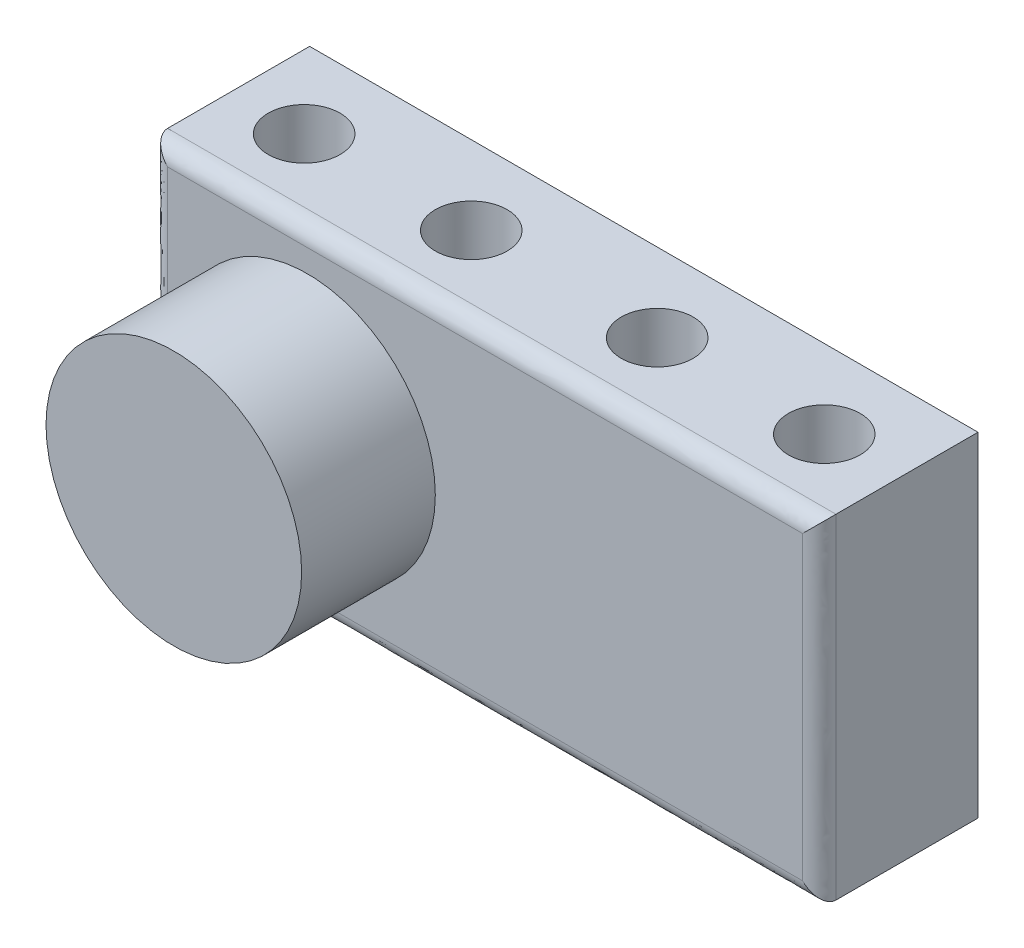
ISO-10303-21;
HEADER;
FILE_DESCRIPTION(('STEP AP214'),'2;1');
FILE_NAME('part.step','',(''),(''),'','','');
FILE_SCHEMA(('AUTOMOTIVE_DESIGN { 1 0 10303 214 1 1 1 1 }'));
ENDSEC;
DATA;
#1=APPLICATION_CONTEXT('core data for automotive mechanical design processes');
#2=APPLICATION_PROTOCOL_DEFINITION('international standard','automotive_design',2000,#1);
#3=PRODUCT_CONTEXT('',#1,'mechanical');
#4=PRODUCT('Part','Part','',(#3));
#5=PRODUCT_RELATED_PRODUCT_CATEGORY('part','',(#4));
#6=PRODUCT_DEFINITION_FORMATION('','',#4);
#7=PRODUCT_DEFINITION_CONTEXT('part definition',#1,'design');
#8=PRODUCT_DEFINITION('design','',#6,#7);
#9=PRODUCT_DEFINITION_SHAPE('','',#8);
#10=(LENGTH_UNIT() NAMED_UNIT(*) SI_UNIT(.MILLI.,.METRE.));
#11=(NAMED_UNIT(*) PLANE_ANGLE_UNIT() SI_UNIT($,.RADIAN.));
#12=(NAMED_UNIT(*) SI_UNIT($,.STERADIAN.) SOLID_ANGLE_UNIT());
#13=UNCERTAINTY_MEASURE_WITH_UNIT(LENGTH_MEASURE(1.E-05),#10,'distance_accuracy_value','');
#14=(GEOMETRIC_REPRESENTATION_CONTEXT(3) GLOBAL_UNCERTAINTY_ASSIGNED_CONTEXT((#13)) GLOBAL_UNIT_ASSIGNED_CONTEXT((#10,
#11,#12)) REPRESENTATION_CONTEXT('',''));
#15=CARTESIAN_POINT('',(0.,0.,0.));
#16=DIRECTION('',(0.,0.,1.));
#17=DIRECTION('',(1.,0.,0.));
#18=AXIS2_PLACEMENT_3D('',#15,#16,#17);
#19=CARTESIAN_POINT('',(20.,10.,9.5));
#20=DIRECTION('',(-1.,0.,0.));
#21=DIRECTION('',(0.,0.,1.));
#22=AXIS2_PLACEMENT_3D('',#19,#20,#21);
#23=PLANE('',#22);
#24=DIRECTION('',(0.,0.,-1.));
#25=VECTOR('',#24,1.);
#26=CARTESIAN_POINT('',(20.,10.,9.5));
#27=LINE('',#26,#25);
#28=CARTESIAN_POINT('',(20.,10.,8.5));
#29=VERTEX_POINT('',#28);
#30=CARTESIAN_POINT('',(20.,10.,0.));
#31=VERTEX_POINT('',#30);
#32=EDGE_CURVE('E97',#29,#31,#27,.T.);
#33=ORIENTED_EDGE('',*,*,#32,.F.);
#34=CARTESIAN_POINT('',(20.,-50.,8.5));
#35=CARTESIAN_POINT('',(20.,-36.6666666666667,8.5));
#36=CARTESIAN_POINT('',(20.,-23.3333333333333,8.5));
#37=CARTESIAN_POINT('',(20.,-10.,8.5));
#38=CARTESIAN_POINT('',(20.,-3.33333333333333,8.5));
#39=CARTESIAN_POINT('',(20.,3.33333333333334,8.5));
#40=CARTESIAN_POINT('',(20.,10.,8.5));
#41=CARTESIAN_POINT('',(20.,23.3333333333333,8.5));
#42=CARTESIAN_POINT('',(20.,36.6666666666667,8.5));
#43=CARTESIAN_POINT('',(20.,50.,8.5));
#44=(BOUNDED_CURVE() B_SPLINE_CURVE(3,(#34,#35,#36,#37,#38,#39,#40,#41,#42,#43),.UNSPECIFIED.,
.F.,.F.) B_SPLINE_CURVE_WITH_KNOTS((4,3,3,4),(-0.06,-0.02,0.,0.04),
.UNSPECIFIED.) CURVE() GEOMETRIC_REPRESENTATION_ITEM() RATIONAL_B_SPLINE_CURVE((1.,1.,1.,1.,1.,
1.,1.,1.,1.,1.)) REPRESENTATION_ITEM(''));
#45=CARTESIAN_POINT('',(20.,-10.,8.5));
#46=VERTEX_POINT('',#45);
#47=EDGE_CURVE('E166',#29,#46,#44,.F.);
#48=ORIENTED_EDGE('',*,*,#47,.T.);
#49=DIRECTION('',(0.,0.,-1.));
#50=VECTOR('',#49,1.);
#51=CARTESIAN_POINT('',(20.,-10.,9.5));
#52=LINE('',#51,#50);
#53=CARTESIAN_POINT('',(20.,-10.,0.));
#54=VERTEX_POINT('',#53);
#55=EDGE_CURVE('E117',#46,#54,#52,.T.);
#56=ORIENTED_EDGE('',*,*,#55,.T.);
#57=DIRECTION('',(0.,1.,0.));
#58=VECTOR('',#57,1.);
#59=CARTESIAN_POINT('',(20.,10.,0.));
#60=LINE('',#59,#58);
#61=EDGE_CURVE('E112',#54,#31,#60,.T.);
#62=ORIENTED_EDGE('',*,*,#61,.T.);
#63=EDGE_LOOP('',(#33,#48,#56,#62));
#64=FACE_BOUND('',#63,.T.);
#65=ADVANCED_FACE('F38',(#64),#23,.F.);
#66=CARTESIAN_POINT('',(-20.,10.,9.5));
#67=DIRECTION('',(0.,-1.,0.));
#68=DIRECTION('',(0.,0.,-1.));
#69=AXIS2_PLACEMENT_3D('',#66,#67,#68);
#70=PLANE('',#69);
#71=CARTESIAN_POINT('',(-15.6286025748178,10.,4.69999999999922));
#72=DIRECTION('',(0.,-1.,0.));
#73=DIRECTION('',(0.,0.,-1.));
#74=AXIS2_PLACEMENT_3D('',#71,#72,#73);
#75=CIRCLE('',#74,2.15);
#76=CARTESIAN_POINT('',(-15.6286025748178,10.,2.54999999999922));
#77=VERTEX_POINT('',#76);
#78=EDGE_CURVE('E123',#77,#77,#75,.T.);
#79=ORIENTED_EDGE('',*,*,#78,.T.);
#80=EDGE_LOOP('',(#79));
#81=FACE_BOUND('',#80,.T.);
#82=CARTESIAN_POINT('',(-5.62860257481785,10.,4.69999999999922));
#83=DIRECTION('',(0.,-1.,0.));
#84=DIRECTION('',(0.,0.,-1.));
#85=AXIS2_PLACEMENT_3D('',#82,#83,#84);
#86=CIRCLE('',#85,2.15);
#87=CARTESIAN_POINT('',(-5.62860257481785,10.,2.54999999999922));
#88=VERTEX_POINT('',#87);
#89=EDGE_CURVE('E403',#88,#88,#86,.T.);
#90=ORIENTED_EDGE('',*,*,#89,.T.);
#91=EDGE_LOOP('',(#90));
#92=FACE_BOUND('',#91,.T.);
#93=CARTESIAN_POINT('',(5.50000000000005,10.,4.69999999999922));
#94=DIRECTION('',(0.,-1.,0.));
#95=DIRECTION('',(0.,0.,-1.));
#96=AXIS2_PLACEMENT_3D('',#93,#94,#95);
#97=CIRCLE('',#96,2.15);
#98=CARTESIAN_POINT('',(5.50000000000005,10.,2.54999999999922));
#99=VERTEX_POINT('',#98);
#100=EDGE_CURVE('E401',#99,#99,#97,.T.);
#101=ORIENTED_EDGE('',*,*,#100,.T.);
#102=EDGE_LOOP('',(#101));
#103=FACE_BOUND('',#102,.T.);
#104=CARTESIAN_POINT('',(15.5000000000001,10.,4.69999999999923));
#105=DIRECTION('',(0.,-1.,0.));
#106=DIRECTION('',(0.,0.,-1.));
#107=AXIS2_PLACEMENT_3D('',#104,#105,#106);
#108=CIRCLE('',#107,2.15);
#109=CARTESIAN_POINT('',(15.5000000000001,10.,2.54999999999923));
#110=VERTEX_POINT('',#109);
#111=EDGE_CURVE('E393',#110,#110,#108,.T.);
#112=ORIENTED_EDGE('',*,*,#111,.T.);
#113=EDGE_LOOP('',(#112));
#114=FACE_BOUND('',#113,.T.);
#115=DIRECTION('',(0.,0.,-1.));
#116=VECTOR('',#115,1.);
#117=CARTESIAN_POINT('',(-20.,10.,9.5));
#118=LINE('',#117,#116);
#119=CARTESIAN_POINT('',(-20.,10.,8.5));
#120=VERTEX_POINT('',#119);
#121=CARTESIAN_POINT('',(-20.,10.,0.));
#122=VERTEX_POINT('',#121);
#123=EDGE_CURVE('E106',#120,#122,#118,.T.);
#124=ORIENTED_EDGE('',*,*,#123,.F.);
#125=CARTESIAN_POINT('',(100.,10.,8.5));
#126=CARTESIAN_POINT('',(73.3333333333333,10.,8.5));
#127=CARTESIAN_POINT('',(46.6666666666667,10.,8.5));
#128=CARTESIAN_POINT('',(20.,10.,8.5));
#129=CARTESIAN_POINT('',(6.66666666666667,10.,8.5));
#130=CARTESIAN_POINT('',(-6.66666666666667,10.,8.5));
#131=CARTESIAN_POINT('',(-20.,10.,8.5));
#132=CARTESIAN_POINT('',(-46.6666666666667,10.,8.5));
#133=CARTESIAN_POINT('',(-73.3333333333334,10.,8.5));
#134=CARTESIAN_POINT('',(-100.,10.,8.5));
#135=(BOUNDED_CURVE() B_SPLINE_CURVE(3,(#125,#126,#127,#128,#129,#130,#131,#132,#133,#134),
.UNSPECIFIED.,.F.,.F.) B_SPLINE_CURVE_WITH_KNOTS((4,3,3,4),(-0.12,-0.04,0.,0.08),
.UNSPECIFIED.) CURVE() GEOMETRIC_REPRESENTATION_ITEM() RATIONAL_B_SPLINE_CURVE((1.,1.,1.,1.,1.,
1.,1.,1.,1.,1.)) REPRESENTATION_ITEM(''));
#136=EDGE_CURVE('E55',#120,#29,#135,.F.);
#137=ORIENTED_EDGE('',*,*,#136,.T.);
#138=ORIENTED_EDGE('',*,*,#32,.T.);
#139=DIRECTION('',(-1.,0.,0.));
#140=VECTOR('',#139,1.);
#141=CARTESIAN_POINT('',(-20.,10.,0.));
#142=LINE('',#141,#140);
#143=EDGE_CURVE('E100',#31,#122,#142,.T.);
#144=ORIENTED_EDGE('',*,*,#143,.T.);
#145=EDGE_LOOP('',(#124,#137,#138,#144));
#146=FACE_BOUND('',#145,.T.);
#147=ADVANCED_FACE('F99',(#81,#92,#103,#114,#146),#70,.F.);
#148=CARTESIAN_POINT('',(-20.,10.,9.5));
#149=DIRECTION('',(1.,0.,0.));
#150=DIRECTION('',(0.,1.,0.));
#151=AXIS2_PLACEMENT_3D('',#148,#149,#150);
#152=PLANE('',#151);
#153=DIRECTION('',(0.,0.,-1.));
#154=VECTOR('',#153,1.);
#155=CARTESIAN_POINT('',(-20.,-10.,9.5));
#156=LINE('',#155,#154);
#157=CARTESIAN_POINT('',(-20.,-10.,8.5));
#158=VERTEX_POINT('',#157);
#159=CARTESIAN_POINT('',(-20.,-10.,0.));
#160=VERTEX_POINT('',#159);
#161=EDGE_CURVE('E130',#158,#160,#156,.T.);
#162=ORIENTED_EDGE('',*,*,#161,.F.);
#163=CARTESIAN_POINT('',(-20.,50.,8.5));
#164=CARTESIAN_POINT('',(-20.,36.6666666666667,8.5));
#165=CARTESIAN_POINT('',(-20.,23.3333333333333,8.5));
#166=CARTESIAN_POINT('',(-20.,10.,8.5));
#167=CARTESIAN_POINT('',(-20.,3.33333333333335,8.5));
#168=CARTESIAN_POINT('',(-20.,-3.33333333333332,8.5));
#169=CARTESIAN_POINT('',(-20.,-9.99999999999999,8.5));
#170=CARTESIAN_POINT('',(-20.,-23.3333333333333,8.5));
#171=CARTESIAN_POINT('',(-20.,-36.6666666666667,8.5));
#172=CARTESIAN_POINT('',(-20.,-50.,8.5));
#173=(BOUNDED_CURVE() B_SPLINE_CURVE(3,(#163,#164,#165,#166,#167,#168,#169,#170,#171,#172),
.UNSPECIFIED.,.F.,.F.) B_SPLINE_CURVE_WITH_KNOTS((4,3,3,4),(-0.04,0.,0.02,0.06),
.UNSPECIFIED.) CURVE() GEOMETRIC_REPRESENTATION_ITEM() RATIONAL_B_SPLINE_CURVE((1.,1.,1.,1.,1.,
1.,1.,1.,1.,1.)) REPRESENTATION_ITEM(''));
#174=EDGE_CURVE('E12',#158,#120,#173,.F.);
#175=ORIENTED_EDGE('',*,*,#174,.T.);
#176=ORIENTED_EDGE('',*,*,#123,.T.);
#177=DIRECTION('',(0.,-1.,0.));
#178=VECTOR('',#177,1.);
#179=CARTESIAN_POINT('',(-20.,10.,0.));
#180=LINE('',#179,#178);
#181=EDGE_CURVE('E114',#122,#160,#180,.T.);
#182=ORIENTED_EDGE('',*,*,#181,.T.);
#183=EDGE_LOOP('',(#162,#175,#176,#182));
#184=FACE_BOUND('',#183,.T.);
#185=ADVANCED_FACE('F243',(#184),#152,.F.);
#186=CARTESIAN_POINT('',(-20.,-10.,9.5));
#187=DIRECTION('',(0.,1.,0.));
#188=DIRECTION('',(0.,0.,1.));
#189=AXIS2_PLACEMENT_3D('',#186,#187,#188);
#190=PLANE('',#189);
#191=CARTESIAN_POINT('',(-15.6286025748178,-10.,4.69999999999922));
#192=DIRECTION('',(0.,-1.,0.));
#193=DIRECTION('',(0.,0.,-1.));
#194=AXIS2_PLACEMENT_3D('',#191,#192,#193);
#195=CIRCLE('',#194,2.15);
#196=CARTESIAN_POINT('',(-15.6286025748178,-10.,2.54999999999922));
#197=VERTEX_POINT('',#196);
#198=EDGE_CURVE('E390',#197,#197,#195,.T.);
#199=ORIENTED_EDGE('',*,*,#198,.F.);
#200=EDGE_LOOP('',(#199));
#201=FACE_BOUND('',#200,.T.);
#202=CARTESIAN_POINT('',(-5.62860257481785,-10.,4.69999999999922));
#203=DIRECTION('',(0.,-1.,0.));
#204=DIRECTION('',(0.,0.,-1.));
#205=AXIS2_PLACEMENT_3D('',#202,#203,#204);
#206=CIRCLE('',#205,2.15);
#207=CARTESIAN_POINT('',(-5.62860257481785,-10.,2.54999999999922));
#208=VERTEX_POINT('',#207);
#209=EDGE_CURVE('E394',#208,#208,#206,.T.);
#210=ORIENTED_EDGE('',*,*,#209,.F.);
#211=EDGE_LOOP('',(#210));
#212=FACE_BOUND('',#211,.T.);
#213=CARTESIAN_POINT('',(5.50000000000005,-10.,4.69999999999922));
#214=DIRECTION('',(0.,-1.,0.));
#215=DIRECTION('',(0.,0.,-1.));
#216=AXIS2_PLACEMENT_3D('',#213,#214,#215);
#217=CIRCLE('',#216,2.15);
#218=CARTESIAN_POINT('',(5.50000000000005,-10.,2.54999999999922));
#219=VERTEX_POINT('',#218);
#220=EDGE_CURVE('E385',#219,#219,#217,.T.);
#221=ORIENTED_EDGE('',*,*,#220,.F.);
#222=EDGE_LOOP('',(#221));
#223=FACE_BOUND('',#222,.T.);
#224=CARTESIAN_POINT('',(15.5000000000001,-10.,4.69999999999923));
#225=DIRECTION('',(0.,-1.,0.));
#226=DIRECTION('',(0.,0.,-1.));
#227=AXIS2_PLACEMENT_3D('',#224,#225,#226);
#228=CIRCLE('',#227,2.15);
#229=CARTESIAN_POINT('',(15.5000000000001,-10.,2.54999999999923));
#230=VERTEX_POINT('',#229);
#231=EDGE_CURVE('E381',#230,#230,#228,.T.);
#232=ORIENTED_EDGE('',*,*,#231,.F.);
#233=EDGE_LOOP('',(#232));
#234=FACE_BOUND('',#233,.T.);
#235=ORIENTED_EDGE('',*,*,#55,.F.);
#236=CARTESIAN_POINT('',(-100.,-10.,8.5));
#237=CARTESIAN_POINT('',(-73.3333333333333,-10.,8.5));
#238=CARTESIAN_POINT('',(-46.6666666666667,-10.,8.5));
#239=CARTESIAN_POINT('',(-20.,-10.,8.5));
#240=CARTESIAN_POINT('',(-6.66666666666667,-10.,8.5));
#241=CARTESIAN_POINT('',(6.66666666666666,-10.,8.5));
#242=CARTESIAN_POINT('',(20.,-10.,8.5));
#243=CARTESIAN_POINT('',(46.6666666666667,-10.,8.5));
#244=CARTESIAN_POINT('',(73.3333333333333,-10.,8.5));
#245=CARTESIAN_POINT('',(100.,-10.,8.5));
#246=(BOUNDED_CURVE() B_SPLINE_CURVE(3,(#236,#237,#238,#239,#240,#241,#242,#243,#244,#245),
.UNSPECIFIED.,.F.,.F.) B_SPLINE_CURVE_WITH_KNOTS((4,3,3,4),(-0.08,0.,0.04,0.12),
.UNSPECIFIED.) CURVE() GEOMETRIC_REPRESENTATION_ITEM() RATIONAL_B_SPLINE_CURVE((1.,1.,1.,1.,1.,
1.,1.,1.,1.,1.)) REPRESENTATION_ITEM(''));
#247=EDGE_CURVE('E158',#46,#158,#246,.F.);
#248=ORIENTED_EDGE('',*,*,#247,.T.);
#249=ORIENTED_EDGE('',*,*,#161,.T.);
#250=DIRECTION('',(1.,0.,0.));
#251=VECTOR('',#250,1.);
#252=CARTESIAN_POINT('',(-20.,-10.,0.));
#253=LINE('',#252,#251);
#254=EDGE_CURVE('E127',#160,#54,#253,.T.);
#255=ORIENTED_EDGE('',*,*,#254,.T.);
#256=EDGE_LOOP('',(#235,#248,#249,#255));
#257=FACE_BOUND('',#256,.T.);
#258=ADVANCED_FACE('F242',(#201,#212,#223,#234,#257),#190,.F.);
#259=CARTESIAN_POINT('',(0.,0.,9.5));
#260=DIRECTION('',(0.,0.,1.));
#261=DIRECTION('',(1.,0.,0.));
#262=AXIS2_PLACEMENT_3D('',#259,#260,#261);
#263=PLANE('',#262);
#264=CARTESIAN_POINT('',(-10.6286025748178,0.,9.5));
#265=DIRECTION('',(0.,0.,1.));
#266=DIRECTION('',(1.,0.,0.));
#267=AXIS2_PLACEMENT_3D('',#264,#265,#266);
#268=CIRCLE('',#267,7.65);
#269=CARTESIAN_POINT('',(-2.97860257481785,0.,9.5));
#270=VERTEX_POINT('',#269);
#271=EDGE_CURVE('E382',#270,#270,#268,.T.);
#272=ORIENTED_EDGE('',*,*,#271,.F.);
#273=EDGE_LOOP('',(#272));
#274=FACE_BOUND('',#273,.T.);
#275=CARTESIAN_POINT('',(-19.,50.,9.5));
#276=CARTESIAN_POINT('',(-19.,36.6666666666667,9.5));
#277=CARTESIAN_POINT('',(-19.,23.3333333333333,9.5));
#278=CARTESIAN_POINT('',(-19.,10.,9.5));
#279=CARTESIAN_POINT('',(-19.,3.33333333333335,9.5));
#280=CARTESIAN_POINT('',(-19.,-3.33333333333332,9.5));
#281=CARTESIAN_POINT('',(-19.,-9.99999999999999,9.5));
#282=CARTESIAN_POINT('',(-19.,-23.3333333333333,9.5));
#283=CARTESIAN_POINT('',(-19.,-36.6666666666667,9.5));
#284=CARTESIAN_POINT('',(-19.,-50.,9.5));
#285=(BOUNDED_CURVE() B_SPLINE_CURVE(3,(#275,#276,#277,#278,#279,#280,#281,#282,#283,#284),
.UNSPECIFIED.,.F.,.F.) B_SPLINE_CURVE_WITH_KNOTS((4,3,3,4),(-0.04,0.,0.02,0.06),
.UNSPECIFIED.) CURVE() GEOMETRIC_REPRESENTATION_ITEM() RATIONAL_B_SPLINE_CURVE((1.,1.,1.,1.,1.,
1.,1.,1.,1.,1.)) REPRESENTATION_ITEM(''));
#286=CARTESIAN_POINT('',(-19.,9.,9.5));
#287=VERTEX_POINT('',#286);
#288=CARTESIAN_POINT('',(-19.,-9.,9.50000000000001));
#289=VERTEX_POINT('',#288);
#290=EDGE_CURVE('E105',#287,#289,#285,.T.);
#291=ORIENTED_EDGE('',*,*,#290,.T.);
#292=CARTESIAN_POINT('',(-100.,-9.,9.5));
#293=CARTESIAN_POINT('',(-73.3333333333333,-9.,9.5));
#294=CARTESIAN_POINT('',(-46.6666666666667,-9.,9.5));
#295=CARTESIAN_POINT('',(-20.,-9.,9.5));
#296=CARTESIAN_POINT('',(-6.66666666666667,-9.,9.5));
#297=CARTESIAN_POINT('',(6.66666666666666,-9.,9.5));
#298=CARTESIAN_POINT('',(20.,-9.,9.5));
#299=CARTESIAN_POINT('',(46.6666666666667,-9.,9.5));
#300=CARTESIAN_POINT('',(73.3333333333333,-9.,9.5));
#301=CARTESIAN_POINT('',(100.,-9.,9.5));
#302=(BOUNDED_CURVE() B_SPLINE_CURVE(3,(#292,#293,#294,#295,#296,#297,#298,#299,#300,#301),
.UNSPECIFIED.,.F.,.F.) B_SPLINE_CURVE_WITH_KNOTS((4,3,3,4),(-0.08,0.,0.04,0.12),
.UNSPECIFIED.) CURVE() GEOMETRIC_REPRESENTATION_ITEM() RATIONAL_B_SPLINE_CURVE((1.,1.,1.,1.,1.,
1.,1.,1.,1.,1.)) REPRESENTATION_ITEM(''));
#303=CARTESIAN_POINT('',(19.,-9.,9.5));
#304=VERTEX_POINT('',#303);
#305=EDGE_CURVE('E150',#289,#304,#302,.T.);
#306=ORIENTED_EDGE('',*,*,#305,.T.);
#307=CARTESIAN_POINT('',(19.,-50.,9.5));
#308=CARTESIAN_POINT('',(19.,-36.6666666666667,9.5));
#309=CARTESIAN_POINT('',(19.,-23.3333333333333,9.5));
#310=CARTESIAN_POINT('',(19.,-10.,9.5));
#311=CARTESIAN_POINT('',(19.,-3.33333333333333,9.5));
#312=CARTESIAN_POINT('',(19.,3.33333333333334,9.5));
#313=CARTESIAN_POINT('',(19.,10.,9.5));
#314=CARTESIAN_POINT('',(19.,23.3333333333333,9.5));
#315=CARTESIAN_POINT('',(19.,36.6666666666667,9.5));
#316=CARTESIAN_POINT('',(19.,50.,9.5));
#317=(BOUNDED_CURVE() B_SPLINE_CURVE(3,(#307,#308,#309,#310,#311,#312,#313,#314,#315,#316),
.UNSPECIFIED.,.F.,.F.) B_SPLINE_CURVE_WITH_KNOTS((4,3,3,4),(-0.06,-0.02,0.,0.04),
.UNSPECIFIED.) CURVE() GEOMETRIC_REPRESENTATION_ITEM() RATIONAL_B_SPLINE_CURVE((1.,1.,1.,1.,1.,
1.,1.,1.,1.,1.)) REPRESENTATION_ITEM(''));
#318=CARTESIAN_POINT('',(19.,9.,9.5));
#319=VERTEX_POINT('',#318);
#320=EDGE_CURVE('E143',#304,#319,#317,.T.);
#321=ORIENTED_EDGE('',*,*,#320,.T.);
#322=CARTESIAN_POINT('',(100.,9.,9.5));
#323=CARTESIAN_POINT('',(73.3333333333333,9.,9.5));
#324=CARTESIAN_POINT('',(46.6666666666667,9.,9.5));
#325=CARTESIAN_POINT('',(20.,9.,9.5));
#326=CARTESIAN_POINT('',(6.66666666666667,9.,9.5));
#327=CARTESIAN_POINT('',(-6.66666666666667,9.,9.5));
#328=CARTESIAN_POINT('',(-20.,9.,9.5));
#329=CARTESIAN_POINT('',(-46.6666666666667,9.,9.5));
#330=CARTESIAN_POINT('',(-73.3333333333334,9.,9.5));
#331=CARTESIAN_POINT('',(-100.,9.,9.5));
#332=(BOUNDED_CURVE() B_SPLINE_CURVE(3,(#322,#323,#324,#325,#326,#327,#328,#329,#330,#331),
.UNSPECIFIED.,.F.,.F.) B_SPLINE_CURVE_WITH_KNOTS((4,3,3,4),(-0.12,-0.04,0.,0.08),
.UNSPECIFIED.) CURVE() GEOMETRIC_REPRESENTATION_ITEM() RATIONAL_B_SPLINE_CURVE((1.,1.,1.,1.,1.,
1.,1.,1.,1.,1.)) REPRESENTATION_ITEM(''));
#333=EDGE_CURVE('E136',#319,#287,#332,.T.);
#334=ORIENTED_EDGE('',*,*,#333,.T.);
#335=EDGE_LOOP('',(#291,#306,#321,#334));
#336=FACE_BOUND('',#335,.T.);
#337=ADVANCED_FACE('F247',(#274,#336),#263,.T.);
#338=CARTESIAN_POINT('',(0.,0.,0.));
#339=DIRECTION('',(0.,0.,1.));
#340=DIRECTION('',(1.,0.,0.));
#341=AXIS2_PLACEMENT_3D('',#338,#339,#340);
#342=PLANE('',#341);
#343=ORIENTED_EDGE('',*,*,#61,.F.);
#344=ORIENTED_EDGE('',*,*,#254,.F.);
#345=ORIENTED_EDGE('',*,*,#181,.F.);
#346=ORIENTED_EDGE('',*,*,#143,.F.);
#347=EDGE_LOOP('',(#343,#344,#345,#346));
#348=FACE_BOUND('',#347,.T.);
#349=ADVANCED_FACE('F110',(#348),#342,.F.);
#350=CARTESIAN_POINT('',(28.336,9.,9.5));
#351=CARTESIAN_POINT('',(25.5573333333333,9.,9.5));
#352=CARTESIAN_POINT('',(22.7786666666667,9.,9.5));
#353=CARTESIAN_POINT('',(20.,9.,9.5));
#354=CARTESIAN_POINT('',(6.66666666666667,9.,9.5));
#355=CARTESIAN_POINT('',(-6.66666666666667,9.,9.5));
#356=CARTESIAN_POINT('',(-20.,9.,9.5));
#357=CARTESIAN_POINT('',(-22.7786666666667,9.,9.5));
#358=CARTESIAN_POINT('',(-25.5573333333333,9.,9.5));
#359=CARTESIAN_POINT('',(-28.336,9.,9.5));
#360=CARTESIAN_POINT('',(28.336,10.,9.5));
#361=CARTESIAN_POINT('',(25.5573333333333,10.,9.5));
#362=CARTESIAN_POINT('',(22.7786666666667,10.,9.5));
#363=CARTESIAN_POINT('',(20.,10.,9.5));
#364=CARTESIAN_POINT('',(6.66666666666667,10.,9.5));
#365=CARTESIAN_POINT('',(-6.66666666666667,10.,9.5));
#366=CARTESIAN_POINT('',(-20.,10.,9.5));
#367=CARTESIAN_POINT('',(-22.7786666666667,10.,9.5));
#368=CARTESIAN_POINT('',(-25.5573333333333,10.,9.5));
#369=CARTESIAN_POINT('',(-28.336,10.,9.5));
#370=CARTESIAN_POINT('',(28.336,10.,8.5));
#371=CARTESIAN_POINT('',(25.5573333333333,10.,8.5));
#372=CARTESIAN_POINT('',(22.7786666666667,10.,8.5));
#373=CARTESIAN_POINT('',(20.,10.,8.5));
#374=CARTESIAN_POINT('',(6.66666666666667,10.,8.5));
#375=CARTESIAN_POINT('',(-6.66666666666667,10.,8.5));
#376=CARTESIAN_POINT('',(-20.,10.,8.5));
#377=CARTESIAN_POINT('',(-22.7786666666667,10.,8.5));
#378=CARTESIAN_POINT('',(-25.5573333333333,10.,8.5));
#379=CARTESIAN_POINT('',(-28.336,10.,8.5));
#380=(BOUNDED_SURFACE() B_SPLINE_SURFACE(2,3,((#350,#351,#352,#353,#354,#355,#356,#357,#358,
#359),(#360,#361,#362,#363,#364,#365,#366,#367,#368,#369),(#370,#371,#372,#373,#374,#375,#376,
#377,#378,#379)),.UNSPECIFIED.,.F.,.F.,.F.) B_SPLINE_SURFACE_WITH_KNOTS((3,3),(4,3,3,4),(0.,1.),
(-0.048336,-0.04,0.,0.008336),
.UNSPECIFIED.) GEOMETRIC_REPRESENTATION_ITEM() RATIONAL_B_SPLINE_SURFACE(((1.,1.,1.,1.,1.,1.,1.,
1.,1.,1.),(0.707106781186548,0.707106781186548,0.707106781186548,0.707106781186548,
0.707106781186548,0.707106781186548,0.707106781186548,0.707106781186548,0.707106781186548,
0.707106781186548),(1.,1.,1.,1.,1.,1.,1.,1.,1.,1.))) REPRESENTATION_ITEM('') SURFACE());
#381=CARTESIAN_POINT('',(20.,10.,8.5));
#382=CARTESIAN_POINT('',(20.0000030280565,10.0000030280565,8.52243252743322));
#383=CARTESIAN_POINT('',(19.9992445090997,9.99924450909966,8.54485119388084));
#384=CARTESIAN_POINT('',(19.9962397778471,9.99623977784712,8.5894710387714));
#385=CARTESIAN_POINT('',(19.9939947299421,9.99399472994211,8.61167237364787));
#386=CARTESIAN_POINT('',(19.9851369433984,9.98513694339842,8.67730438672846));
#387=CARTESIAN_POINT('',(19.9764000530369,9.97640005303693,8.72019157335714));
#388=CARTESIAN_POINT('',(19.9539385439945,9.95393854399451,8.80306063968412));
#389=CARTESIAN_POINT('',(19.9402276443665,9.9402276443665,8.84305015109429));
#390=CARTESIAN_POINT('',(19.9086320129088,9.90863201290882,8.91965424065308));
#391=CARTESIAN_POINT('',(19.8907378534415,9.89073785344155,8.95626093114842));
#392=CARTESIAN_POINT('',(19.8436221180181,9.84362211801811,9.03986156899779));
#393=CARTESIAN_POINT('',(19.8127574566784,9.81275745667839,9.0850012067991));
#394=CARTESIAN_POINT('',(19.7463244925176,9.74632449251764,9.16770127746889));
#395=CARTESIAN_POINT('',(19.7107473091861,9.71074730918617,9.20524705391033));
#396=CARTESIAN_POINT('',(19.6219281670451,9.62192816704505,9.28618006154996));
#397=CARTESIAN_POINT('',(19.5671686578559,9.56716865785579,9.32622746344236));
#398=CARTESIAN_POINT('',(19.4538797107646,9.45387971076468,9.3934993302396));
#399=CARTESIAN_POINT('',(19.395345854546,9.39534585454641,9.42070844489884));
#400=CARTESIAN_POINT('',(19.2816276412662,9.28162764126585,9.46124281698466));
#401=CARTESIAN_POINT('',(19.2266237861864,9.22662378618502,9.47560690461873));
#402=CARTESIAN_POINT('',(19.115887870352,9.11588787035337,9.49484628917621));
#403=CARTESIAN_POINT('',(19.0601575485684,9.06015754857366,9.49974112588816));
#404=CARTESIAN_POINT('',(19.0029813888135,9.00298138881381,9.49999666252605));
#405=CARTESIAN_POINT('',(19.0014906738578,9.00149067385797,9.49999999543511));
#406=CARTESIAN_POINT('',(18.9999999999999,8.99999999999994,9.5));
#407=B_SPLINE_CURVE_WITH_KNOTS('',3,(#381,#382,#383,#384,#385,#386,#387,#388,#389,#390,#391,
#392,#393,#394,#395,#396,#397,#398,#399,#400,#401,#402,#403,#404,#405,#406),.UNSPECIFIED.,.F.,
.F.,(4,2,2,2,2,2,2,2,2,2,2,2,4),(0.,0.067245739604832,0.134438868172214,0.267559824129511,
0.400316370108645,0.53337503835473,0.720712178250318,0.908407505989975,1.16855696340394,
1.42901668818516,1.66575363888482,1.90200155988639,1.90832612311249),.UNSPECIFIED.);
#408=EDGE_CURVE('E121',#29,#319,#407,.T.);
#409=CARTESIAN_POINT('',(-20.,10.,8.5));
#410=CARTESIAN_POINT('',(-20.0000030280565,10.0000030280565,8.52243252743322));
#411=CARTESIAN_POINT('',(-19.9992445090997,9.99924450909966,8.54485119388084));
#412=CARTESIAN_POINT('',(-19.9962397778471,9.99623977784712,8.5894710387714));
#413=CARTESIAN_POINT('',(-19.9939947299421,9.9939947299421,8.61167237364787));
#414=CARTESIAN_POINT('',(-19.9851369433984,9.98513694339842,8.67730438672846));
#415=CARTESIAN_POINT('',(-19.9764000530369,9.97640005303693,8.72019157335714));
#416=CARTESIAN_POINT('',(-19.9539385439945,9.95393854399451,8.80306063968412));
#417=CARTESIAN_POINT('',(-19.9402276443665,9.9402276443665,8.84305015109429));
#418=CARTESIAN_POINT('',(-19.9086320129088,9.90863201290882,8.91965424065309));
#419=CARTESIAN_POINT('',(-19.8907378534416,9.89073785344154,8.95626093114842));
#420=CARTESIAN_POINT('',(-19.8436221180181,9.84362211801811,9.03986156899779));
#421=CARTESIAN_POINT('',(-19.8127574566784,9.8127574566784,9.0850012067991));
#422=CARTESIAN_POINT('',(-19.7463244925176,9.74632449251765,9.16770127746888));
#423=CARTESIAN_POINT('',(-19.7107473091862,9.71074730918617,9.20524705391033));
#424=CARTESIAN_POINT('',(-19.6219281670451,9.62192816704505,9.28618006154997));
#425=CARTESIAN_POINT('',(-19.5671686578559,9.56716865785578,9.32622746344238));
#426=CARTESIAN_POINT('',(-19.4538797107646,9.45387971076468,9.3934993302396));
#427=CARTESIAN_POINT('',(-19.395345854546,9.39534585454642,9.42070844489883));
#428=CARTESIAN_POINT('',(-19.2816276412662,9.28162764126584,9.46124281698466));
#429=CARTESIAN_POINT('',(-19.2266237861865,9.22662378618499,9.47560690461874));
#430=CARTESIAN_POINT('',(-19.115887870352,9.11588787035342,9.49484628917619));
#431=CARTESIAN_POINT('',(-19.0601575485683,9.0601575485738,9.49974112588809));
#432=CARTESIAN_POINT('',(-19.0029813888135,9.00298138881382,9.49999666252605));
#433=CARTESIAN_POINT('',(-19.0014906738578,9.00149067385797,9.49999999543511));
#434=CARTESIAN_POINT('',(-18.9999999999999,8.99999999999994,9.5));
#435=B_SPLINE_CURVE_WITH_KNOTS('',3,(#409,#410,#411,#412,#413,#414,#415,#416,#417,#418,#419,
#420,#421,#422,#423,#424,#425,#426,#427,#428,#429,#430,#431,#432,#433,#434),.UNSPECIFIED.,.F.,
.F.,(4,2,2,2,2,2,2,2,2,2,2,2,4),(0.,0.067245739604832,0.134438868172213,0.26755982412951,
0.400316370108645,0.533375038354727,0.720712178250314,0.908407505989972,1.16855696340395,
1.42901668818516,1.66575363888482,1.90200155988638,1.90832612311249),.UNSPECIFIED.);
#436=EDGE_CURVE('E46',#287,#120,#435,.F.);
#437=ORIENTED_EDGE('',*,*,#408,.F.);
#438=ORIENTED_EDGE('',*,*,#136,.F.);
#439=ORIENTED_EDGE('',*,*,#436,.F.);
#440=ORIENTED_EDGE('',*,*,#333,.F.);
#441=EDGE_LOOP('',(#437,#438,#439,#440));
#442=FACE_BOUND('',#441,.T.);
#443=ADVANCED_FACE('F216',(#442),#380,.T.);
#444=CARTESIAN_POINT('',(-19.,14.168,9.5));
#445=CARTESIAN_POINT('',(-19.,12.7786666666667,9.5));
#446=CARTESIAN_POINT('',(-19.,11.3893333333333,9.5));
#447=CARTESIAN_POINT('',(-19.,10.,9.5));
#448=CARTESIAN_POINT('',(-19.,3.33333333333335,9.5));
#449=CARTESIAN_POINT('',(-19.,-3.33333333333332,9.5));
#450=CARTESIAN_POINT('',(-19.,-9.99999999999999,9.5));
#451=CARTESIAN_POINT('',(-19.,-11.3893333333333,9.5));
#452=CARTESIAN_POINT('',(-19.,-12.7786666666667,9.5));
#453=CARTESIAN_POINT('',(-19.,-14.168,9.5));
#454=CARTESIAN_POINT('',(-20.,14.168,9.5));
#455=CARTESIAN_POINT('',(-20.,12.7786666666667,9.5));
#456=CARTESIAN_POINT('',(-20.,11.3893333333333,9.5));
#457=CARTESIAN_POINT('',(-20.,10.,9.5));
#458=CARTESIAN_POINT('',(-20.,3.33333333333335,9.5));
#459=CARTESIAN_POINT('',(-20.,-3.33333333333332,9.5));
#460=CARTESIAN_POINT('',(-20.,-9.99999999999999,9.5));
#461=CARTESIAN_POINT('',(-20.,-11.3893333333333,9.5));
#462=CARTESIAN_POINT('',(-20.,-12.7786666666667,9.5));
#463=CARTESIAN_POINT('',(-20.,-14.168,9.5));
#464=CARTESIAN_POINT('',(-20.,14.168,8.5));
#465=CARTESIAN_POINT('',(-20.,12.7786666666667,8.5));
#466=CARTESIAN_POINT('',(-20.,11.3893333333333,8.5));
#467=CARTESIAN_POINT('',(-20.,10.,8.5));
#468=CARTESIAN_POINT('',(-20.,3.33333333333335,8.5));
#469=CARTESIAN_POINT('',(-20.,-3.33333333333332,8.5));
#470=CARTESIAN_POINT('',(-20.,-9.99999999999999,8.5));
#471=CARTESIAN_POINT('',(-20.,-11.3893333333333,8.5));
#472=CARTESIAN_POINT('',(-20.,-12.7786666666667,8.5));
#473=CARTESIAN_POINT('',(-20.,-14.168,8.5));
#474=(BOUNDED_SURFACE() B_SPLINE_SURFACE(2,3,((#444,#445,#446,#447,#448,#449,#450,#451,#452,
#453),(#454,#455,#456,#457,#458,#459,#460,#461,#462,#463),(#464,#465,#466,#467,#468,#469,#470,
#471,#472,#473)),.UNSPECIFIED.,.F.,.F.,.F.) B_SPLINE_SURFACE_WITH_KNOTS((3,3),(4,3,3,4),(0.,1.),
(-0.00416799999999999,0.,0.02,0.024168),
.UNSPECIFIED.) GEOMETRIC_REPRESENTATION_ITEM() RATIONAL_B_SPLINE_SURFACE(((1.,1.,1.,1.,1.,1.,1.,
1.,1.,1.),(0.707106781186548,0.707106781186548,0.707106781186548,0.707106781186548,
0.707106781186548,0.707106781186548,0.707106781186548,0.707106781186548,0.707106781186548,
0.707106781186548),(1.,1.,1.,1.,1.,1.,1.,1.,1.,1.))) REPRESENTATION_ITEM('') SURFACE());
#475=CARTESIAN_POINT('',(-20.,-9.99999999999999,8.5));
#476=CARTESIAN_POINT('',(-20.0000030280565,-10.0000030280565,8.52243252743322));
#477=CARTESIAN_POINT('',(-19.9992445090997,-9.99924450909966,8.54485119388084));
#478=CARTESIAN_POINT('',(-19.9962397778471,-9.99623977784712,8.5894710387714));
#479=CARTESIAN_POINT('',(-19.9939947299421,-9.9939947299421,8.61167237364787));
#480=CARTESIAN_POINT('',(-19.9851369433984,-9.98513694339841,8.67730438672846));
#481=CARTESIAN_POINT('',(-19.9764000530369,-9.97640005303693,8.72019157335714));
#482=CARTESIAN_POINT('',(-19.9539385439945,-9.9539385439945,8.80306063968412));
#483=CARTESIAN_POINT('',(-19.9402276443665,-9.9402276443665,8.84305015109429));
#484=CARTESIAN_POINT('',(-19.9086320129088,-9.90863201290881,8.91965424065308));
#485=CARTESIAN_POINT('',(-19.8907378534415,-9.89073785344154,8.95626093114841));
#486=CARTESIAN_POINT('',(-19.8436221180181,-9.84362211801811,9.03986156899779));
#487=CARTESIAN_POINT('',(-19.8127574566784,-9.8127574566784,9.0850012067991));
#488=CARTESIAN_POINT('',(-19.7463244925176,-9.74632449251764,9.16770127746889));
#489=CARTESIAN_POINT('',(-19.7107473091862,-9.71074730918616,9.20524705391033));
#490=CARTESIAN_POINT('',(-19.6219281670451,-9.62192816704506,9.28618006154996));
#491=CARTESIAN_POINT('',(-19.5671686578559,-9.56716865785585,9.32622746344236));
#492=CARTESIAN_POINT('',(-19.4538797107646,-9.45387971076461,9.39349933023959));
#493=CARTESIAN_POINT('',(-19.3953458545462,-9.39534585454617,9.42070844489883));
#494=CARTESIAN_POINT('',(-19.281627641266,-9.28162764126606,9.46124281698466));
#495=CARTESIAN_POINT('',(-19.2266237861857,-9.22662378618579,9.47560690461873));
#496=CARTESIAN_POINT('',(-19.1158878703527,-9.11588787035263,9.4948462891762));
#497=CARTESIAN_POINT('',(-19.0601575485713,-9.06015754857084,9.49974112588813));
#498=CARTESIAN_POINT('',(-19.0029813888137,-9.00298138881366,9.49999666252605));
#499=CARTESIAN_POINT('',(-19.0014906738579,-9.00149067385789,9.49999999543511));
#500=CARTESIAN_POINT('',(-18.9999999999999,-8.99999999999993,9.5));
#501=B_SPLINE_CURVE_WITH_KNOTS('',3,(#475,#476,#477,#478,#479,#480,#481,#482,#483,#484,#485,
#486,#487,#488,#489,#490,#491,#492,#493,#494,#495,#496,#497,#498,#499,#500),.UNSPECIFIED.,.F.,
.F.,(4,2,2,2,2,2,2,2,2,2,2,2,4),(0.,0.0672457396048316,0.134438868172213,0.267559824129509,
0.400316370108641,0.533375038354729,0.720712178250311,0.908407505989962,1.16855696340393,
1.42901668818515,1.66575363888481,1.90200155988638,1.90832612311249),.UNSPECIFIED.);
#502=EDGE_CURVE('E195',#289,#158,#501,.F.);
#503=ORIENTED_EDGE('',*,*,#436,.T.);
#504=ORIENTED_EDGE('',*,*,#174,.F.);
#505=ORIENTED_EDGE('',*,*,#502,.F.);
#506=ORIENTED_EDGE('',*,*,#290,.F.);
#507=EDGE_LOOP('',(#503,#504,#505,#506));
#508=FACE_BOUND('',#507,.T.);
#509=ADVANCED_FACE('F41',(#508),#474,.T.);
#510=CARTESIAN_POINT('',(19.,-14.168,9.5));
#511=CARTESIAN_POINT('',(19.,-12.7786666666667,9.5));
#512=CARTESIAN_POINT('',(19.,-11.3893333333333,9.5));
#513=CARTESIAN_POINT('',(19.,-10.,9.5));
#514=CARTESIAN_POINT('',(19.,-3.33333333333333,9.5));
#515=CARTESIAN_POINT('',(19.,3.33333333333334,9.5));
#516=CARTESIAN_POINT('',(19.,10.,9.5));
#517=CARTESIAN_POINT('',(19.,11.3893333333333,9.5));
#518=CARTESIAN_POINT('',(19.,12.7786666666667,9.5));
#519=CARTESIAN_POINT('',(19.,14.168,9.5));
#520=CARTESIAN_POINT('',(20.,-14.168,9.5));
#521=CARTESIAN_POINT('',(20.,-12.7786666666667,9.5));
#522=CARTESIAN_POINT('',(20.,-11.3893333333333,9.5));
#523=CARTESIAN_POINT('',(20.,-10.,9.5));
#524=CARTESIAN_POINT('',(20.,-3.33333333333333,9.5));
#525=CARTESIAN_POINT('',(20.,3.33333333333334,9.5));
#526=CARTESIAN_POINT('',(20.,10.,9.5));
#527=CARTESIAN_POINT('',(20.,11.3893333333333,9.5));
#528=CARTESIAN_POINT('',(20.,12.7786666666667,9.5));
#529=CARTESIAN_POINT('',(20.,14.168,9.5));
#530=CARTESIAN_POINT('',(20.,-14.168,8.5));
#531=CARTESIAN_POINT('',(20.,-12.7786666666667,8.5));
#532=CARTESIAN_POINT('',(20.,-11.3893333333333,8.5));
#533=CARTESIAN_POINT('',(20.,-10.,8.5));
#534=CARTESIAN_POINT('',(20.,-3.33333333333333,8.5));
#535=CARTESIAN_POINT('',(20.,3.33333333333334,8.5));
#536=CARTESIAN_POINT('',(20.,10.,8.5));
#537=CARTESIAN_POINT('',(20.,11.3893333333333,8.5));
#538=CARTESIAN_POINT('',(20.,12.7786666666667,8.5));
#539=CARTESIAN_POINT('',(20.,14.168,8.5));
#540=(BOUNDED_SURFACE() B_SPLINE_SURFACE(2,3,((#510,#511,#512,#513,#514,#515,#516,#517,#518,
#519),(#520,#521,#522,#523,#524,#525,#526,#527,#528,#529),(#530,#531,#532,#533,#534,#535,#536,
#537,#538,#539)),.UNSPECIFIED.,.F.,.F.,.F.) B_SPLINE_SURFACE_WITH_KNOTS((3,3),(4,3,3,4),(0.,1.),
(-0.024168,-0.02,0.,0.004168),
.UNSPECIFIED.) GEOMETRIC_REPRESENTATION_ITEM() RATIONAL_B_SPLINE_SURFACE(((1.,1.,1.,1.,1.,1.,1.,
1.,1.,1.),(0.707106781186548,0.707106781186548,0.707106781186548,0.707106781186548,
0.707106781186548,0.707106781186548,0.707106781186548,0.707106781186548,0.707106781186548,
0.707106781186548),(1.,1.,1.,1.,1.,1.,1.,1.,1.,1.))) REPRESENTATION_ITEM('') SURFACE());
#541=CARTESIAN_POINT('',(20.,-10.,8.5));
#542=CARTESIAN_POINT('',(20.0000030280565,-10.0000030280565,8.52243252743322));
#543=CARTESIAN_POINT('',(19.9992445090997,-9.99924450909966,8.54485119388084));
#544=CARTESIAN_POINT('',(19.9962397778471,-9.99623977784712,8.5894710387714));
#545=CARTESIAN_POINT('',(19.9939947299421,-9.9939947299421,8.61167237364787));
#546=CARTESIAN_POINT('',(19.9851369433984,-9.98513694339842,8.67730438672846));
#547=CARTESIAN_POINT('',(19.9764000530369,-9.97640005303693,8.72019157335714));
#548=CARTESIAN_POINT('',(19.9539385439945,-9.95393854399451,8.80306063968412));
#549=CARTESIAN_POINT('',(19.9402276443665,-9.9402276443665,8.84305015109429));
#550=CARTESIAN_POINT('',(19.9086320129088,-9.90863201290882,8.91965424065309));
#551=CARTESIAN_POINT('',(19.8907378534415,-9.89073785344154,8.95626093114842));
#552=CARTESIAN_POINT('',(19.8436221180181,-9.8436221180181,9.03986156899779));
#553=CARTESIAN_POINT('',(19.8127574566784,-9.8127574566784,9.0850012067991));
#554=CARTESIAN_POINT('',(19.7463244925176,-9.74632449251765,9.16770127746888));
#555=CARTESIAN_POINT('',(19.7107473091861,-9.71074730918618,9.20524705391033));
#556=CARTESIAN_POINT('',(19.6219281670451,-9.62192816704504,9.28618006154996));
#557=CARTESIAN_POINT('',(19.5671686578559,-9.56716865785575,9.32622746344237));
#558=CARTESIAN_POINT('',(19.4538797107645,-9.45387971076472,9.3934993302396));
#559=CARTESIAN_POINT('',(19.3953458545458,-9.39534585454657,9.42070844489883));
#560=CARTESIAN_POINT('',(19.2816276412664,-9.28162764126571,9.46124281698466));
#561=CARTESIAN_POINT('',(19.2266237861869,-9.22662378618451,9.47560690461874));
#562=CARTESIAN_POINT('',(19.1158878703515,-9.11588787035386,9.4948462891762));
#563=CARTESIAN_POINT('',(19.0601575485666,-9.06015754857549,9.49974112588811));
#564=CARTESIAN_POINT('',(19.0029813888134,-9.0029813888139,9.49999666252605));
#565=CARTESIAN_POINT('',(19.0014906738578,-9.00149067385801,9.49999999543511));
#566=CARTESIAN_POINT('',(18.9999999999999,-8.99999999999993,9.5));
#567=B_SPLINE_CURVE_WITH_KNOTS('',3,(#541,#542,#543,#544,#545,#546,#547,#548,#549,#550,#551,
#552,#553,#554,#555,#556,#557,#558,#559,#560,#561,#562,#563,#564,#565,#566),.UNSPECIFIED.,.F.,
.F.,(4,2,2,2,2,2,2,2,2,2,2,2,4),(0.,0.0672457396048317,0.134438868172212,0.267559824129508,
0.400316370108644,0.53337503835473,0.720712178250316,0.908407505989973,1.16855696340395,
1.42901668818516,1.66575363888482,1.9020015598864,1.90832612311249),.UNSPECIFIED.);
#568=EDGE_CURVE('E184',#46,#304,#567,.T.);
#569=ORIENTED_EDGE('',*,*,#408,.T.);
#570=ORIENTED_EDGE('',*,*,#320,.F.);
#571=ORIENTED_EDGE('',*,*,#568,.F.);
#572=ORIENTED_EDGE('',*,*,#47,.F.);
#573=EDGE_LOOP('',(#569,#570,#571,#572));
#574=FACE_BOUND('',#573,.T.);
#575=ADVANCED_FACE('F207',(#574),#540,.T.);
#576=CARTESIAN_POINT('',(-28.336,-9.,9.5));
#577=CARTESIAN_POINT('',(-25.5573333333333,-9.,9.5));
#578=CARTESIAN_POINT('',(-22.7786666666667,-9.,9.5));
#579=CARTESIAN_POINT('',(-20.,-9.,9.5));
#580=CARTESIAN_POINT('',(-6.66666666666667,-9.,9.5));
#581=CARTESIAN_POINT('',(6.66666666666666,-9.,9.5));
#582=CARTESIAN_POINT('',(20.,-9.,9.5));
#583=CARTESIAN_POINT('',(22.7786666666667,-9.,9.5));
#584=CARTESIAN_POINT('',(25.5573333333333,-9.,9.5));
#585=CARTESIAN_POINT('',(28.336,-9.,9.5));
#586=CARTESIAN_POINT('',(-28.336,-10.,9.5));
#587=CARTESIAN_POINT('',(-25.5573333333333,-10.,9.5));
#588=CARTESIAN_POINT('',(-22.7786666666667,-10.,9.5));
#589=CARTESIAN_POINT('',(-20.,-10.,9.5));
#590=CARTESIAN_POINT('',(-6.66666666666667,-10.,9.5));
#591=CARTESIAN_POINT('',(6.66666666666666,-10.,9.5));
#592=CARTESIAN_POINT('',(20.,-10.,9.5));
#593=CARTESIAN_POINT('',(22.7786666666667,-10.,9.5));
#594=CARTESIAN_POINT('',(25.5573333333333,-10.,9.5));
#595=CARTESIAN_POINT('',(28.336,-10.,9.50000000000001));
#596=CARTESIAN_POINT('',(-28.336,-10.,8.5));
#597=CARTESIAN_POINT('',(-25.5573333333333,-10.,8.5));
#598=CARTESIAN_POINT('',(-22.7786666666667,-10.,8.5));
#599=CARTESIAN_POINT('',(-20.,-10.,8.5));
#600=CARTESIAN_POINT('',(-6.66666666666667,-10.,8.5));
#601=CARTESIAN_POINT('',(6.66666666666666,-10.,8.5));
#602=CARTESIAN_POINT('',(20.,-10.,8.5));
#603=CARTESIAN_POINT('',(22.7786666666667,-10.,8.5));
#604=CARTESIAN_POINT('',(25.5573333333333,-10.,8.5));
#605=CARTESIAN_POINT('',(28.336,-10.,8.5));
#606=(BOUNDED_SURFACE() B_SPLINE_SURFACE(2,3,((#576,#577,#578,#579,#580,#581,#582,#583,#584,
#585),(#586,#587,#588,#589,#590,#591,#592,#593,#594,#595),(#596,#597,#598,#599,#600,#601,#602,
#603,#604,#605)),.UNSPECIFIED.,.F.,.F.,.F.) B_SPLINE_SURFACE_WITH_KNOTS((3,3),(4,3,3,4),(0.,1.),
(-0.00833600000000002,0.,0.04,0.048336),
.UNSPECIFIED.) GEOMETRIC_REPRESENTATION_ITEM() RATIONAL_B_SPLINE_SURFACE(((1.,1.,1.,1.,1.,1.,1.,
1.,1.,1.),(0.707106781186548,0.707106781186548,0.707106781186548,0.707106781186548,
0.707106781186548,0.707106781186548,0.707106781186548,0.707106781186548,0.707106781186548,
0.707106781186548),(1.,1.,1.,1.,1.,1.,1.,1.,1.,1.))) REPRESENTATION_ITEM('') SURFACE());
#607=ORIENTED_EDGE('',*,*,#502,.T.);
#608=ORIENTED_EDGE('',*,*,#247,.F.);
#609=ORIENTED_EDGE('',*,*,#568,.T.);
#610=ORIENTED_EDGE('',*,*,#305,.F.);
#611=EDGE_LOOP('',(#607,#608,#609,#610));
#612=FACE_BOUND('',#611,.T.);
#613=ADVANCED_FACE('F201',(#612),#606,.T.);
#614=CARTESIAN_POINT('',(15.5000000000001,10.0882467350377,4.69999999999923));
#615=DIRECTION('',(0.,-1.,0.));
#616=DIRECTION('',(0.,0.,-1.));
#617=AXIS2_PLACEMENT_3D('',#614,#615,#616);
#618=CYLINDRICAL_SURFACE('',#617,2.15);
#619=ORIENTED_EDGE('',*,*,#231,.T.);
#620=EDGE_LOOP('',(#619));
#621=FACE_BOUND('',#620,.T.);
#622=ORIENTED_EDGE('',*,*,#111,.F.);
#623=EDGE_LOOP('',(#622));
#624=FACE_BOUND('',#623,.T.);
#625=ADVANCED_FACE('F307',(#621,#624),#618,.F.);
#626=CARTESIAN_POINT('',(5.50000000000005,10.0882467350377,4.69999999999922));
#627=DIRECTION('',(0.,-1.,0.));
#628=DIRECTION('',(0.,0.,-1.));
#629=AXIS2_PLACEMENT_3D('',#626,#627,#628);
#630=CYLINDRICAL_SURFACE('',#629,2.15);
#631=ORIENTED_EDGE('',*,*,#220,.T.);
#632=EDGE_LOOP('',(#631));
#633=FACE_BOUND('',#632,.T.);
#634=ORIENTED_EDGE('',*,*,#100,.F.);
#635=EDGE_LOOP('',(#634));
#636=FACE_BOUND('',#635,.T.);
#637=ADVANCED_FACE('F312',(#633,#636),#630,.F.);
#638=CARTESIAN_POINT('',(-5.62860257481785,10.0882467350377,4.69999999999922));
#639=DIRECTION('',(0.,-1.,0.));
#640=DIRECTION('',(0.,0.,-1.));
#641=AXIS2_PLACEMENT_3D('',#638,#639,#640);
#642=CYLINDRICAL_SURFACE('',#641,2.15);
#643=ORIENTED_EDGE('',*,*,#209,.T.);
#644=EDGE_LOOP('',(#643));
#645=FACE_BOUND('',#644,.T.);
#646=ORIENTED_EDGE('',*,*,#89,.F.);
#647=EDGE_LOOP('',(#646));
#648=FACE_BOUND('',#647,.T.);
#649=ADVANCED_FACE('F320',(#645,#648),#642,.F.);
#650=CARTESIAN_POINT('',(-15.6286025748178,10.0882467350377,4.69999999999922));
#651=DIRECTION('',(0.,-1.,0.));
#652=DIRECTION('',(0.,0.,-1.));
#653=AXIS2_PLACEMENT_3D('',#650,#651,#652);
#654=CYLINDRICAL_SURFACE('',#653,2.15);
#655=ORIENTED_EDGE('',*,*,#198,.T.);
#656=EDGE_LOOP('',(#655));
#657=FACE_BOUND('',#656,.T.);
#658=ORIENTED_EDGE('',*,*,#78,.F.);
#659=EDGE_LOOP('',(#658));
#660=FACE_BOUND('',#659,.T.);
#661=ADVANCED_FACE('F328',(#657,#660),#654,.F.);
#662=CARTESIAN_POINT('',(-10.6286025748178,0.,39.1374675043084));
#663=DIRECTION('',(0.,0.,-1.));
#664=DIRECTION('',(-1.,0.,0.));
#665=AXIS2_PLACEMENT_3D('',#662,#663,#664);
#666=CYLINDRICAL_SURFACE('',#665,7.65);
#667=ORIENTED_EDGE('',*,*,#271,.T.);
#668=EDGE_LOOP('',(#667));
#669=FACE_BOUND('',#668,.T.);
#670=CARTESIAN_POINT('',(-10.6286025748178,0.,17.5));
#671=DIRECTION('',(0.,0.,1.));
#672=DIRECTION('',(1.,0.,0.));
#673=AXIS2_PLACEMENT_3D('',#670,#671,#672);
#674=CIRCLE('',#673,7.65);
#675=CARTESIAN_POINT('',(-2.97860257481785,0.,17.5));
#676=VERTEX_POINT('',#675);
#677=EDGE_CURVE('E379',#676,#676,#674,.T.);
#678=ORIENTED_EDGE('',*,*,#677,.F.);
#679=EDGE_LOOP('',(#678));
#680=FACE_BOUND('',#679,.T.);
#681=ADVANCED_FACE('F335',(#669,#680),#666,.T.);
#682=CARTESIAN_POINT('',(-10.6286025748178,0.,17.5));
#683=DIRECTION('',(0.,0.,1.));
#684=DIRECTION('',(1.,0.,0.));
#685=AXIS2_PLACEMENT_3D('',#682,#683,#684);
#686=PLANE('',#685);
#687=ORIENTED_EDGE('',*,*,#677,.T.);
#688=EDGE_LOOP('',(#687));
#689=FACE_BOUND('',#688,.T.);
#690=ADVANCED_FACE('F342',(#689),#686,.T.);
#691=CLOSED_SHELL('',(#65,#147,#185,#258,#337,#349,#443,#509,#575,#613,#625,#637,#649,#661,#681,#690));
#692=MANIFOLD_SOLID_BREP('B2',#691);
#693=ADVANCED_BREP_SHAPE_REPRESENTATION('',(#18,#692),#14);
#694=SHAPE_DEFINITION_REPRESENTATION(#9,#693);
ENDSEC;
END-ISO-10303-21;
